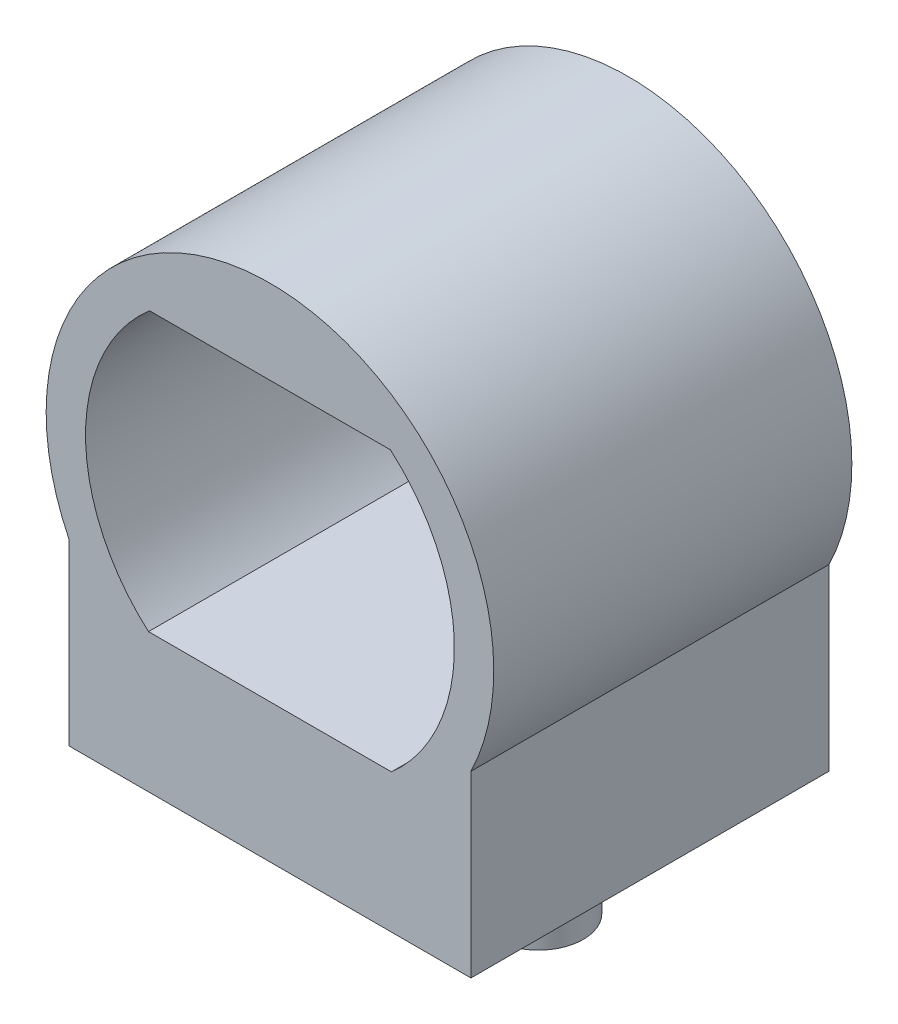
ISO-10303-21;
HEADER;
FILE_DESCRIPTION(('STEP AP214'),'2;1');
FILE_NAME('part.step','',(''),(''),'','','');
FILE_SCHEMA(('AUTOMOTIVE_DESIGN { 1 0 10303 214 1 1 1 1 }'));
ENDSEC;
DATA;
#1=APPLICATION_CONTEXT('core data for automotive mechanical design processes');
#2=APPLICATION_PROTOCOL_DEFINITION('international standard','automotive_design',2000,#1);
#3=PRODUCT_CONTEXT('',#1,'mechanical');
#4=PRODUCT('Part','Part','',(#3));
#5=PRODUCT_RELATED_PRODUCT_CATEGORY('part','',(#4));
#6=PRODUCT_DEFINITION_FORMATION('','',#4);
#7=PRODUCT_DEFINITION_CONTEXT('part definition',#1,'design');
#8=PRODUCT_DEFINITION('design','',#6,#7);
#9=PRODUCT_DEFINITION_SHAPE('','',#8);
#10=(LENGTH_UNIT() NAMED_UNIT(*) SI_UNIT(.MILLI.,.METRE.));
#11=(NAMED_UNIT(*) PLANE_ANGLE_UNIT() SI_UNIT($,.RADIAN.));
#12=(NAMED_UNIT(*) SI_UNIT($,.STERADIAN.) SOLID_ANGLE_UNIT());
#13=UNCERTAINTY_MEASURE_WITH_UNIT(LENGTH_MEASURE(1.E-05),#10,'distance_accuracy_value','');
#14=(GEOMETRIC_REPRESENTATION_CONTEXT(3) GLOBAL_UNCERTAINTY_ASSIGNED_CONTEXT((#13)) GLOBAL_UNIT_ASSIGNED_CONTEXT((#10,
#11,#12)) REPRESENTATION_CONTEXT('',''));
#15=CARTESIAN_POINT('',(0.,0.,0.));
#16=DIRECTION('',(0.,0.,1.));
#17=DIRECTION('',(1.,0.,0.));
#18=AXIS2_PLACEMENT_3D('',#15,#16,#17);
#19=CARTESIAN_POINT('',(0.,0.,0.));
#20=DIRECTION('',(0.,0.,1.));
#21=DIRECTION('',(1.,0.,0.));
#22=AXIS2_PLACEMENT_3D('',#19,#20,#21);
#23=PLANE('',#22);
#24=CARTESIAN_POINT('',(0.,0.,0.));
#25=DIRECTION('',(0.,0.,1.));
#26=DIRECTION('',(1.,0.,0.));
#27=AXIS2_PLACEMENT_3D('',#24,#25,#26);
#28=CIRCLE('',#27,10.3);
#29=CARTESIAN_POINT('',(6.78435700711571,-7.75,0.));
#30=VERTEX_POINT('',#29);
#31=CARTESIAN_POINT('',(6.72681202353686,7.8,0.));
#32=VERTEX_POINT('',#31);
#33=EDGE_CURVE('E67',#30,#32,#28,.T.);
#34=ORIENTED_EDGE('',*,*,#33,.F.);
#35=DIRECTION('',(1.,0.,0.));
#36=VECTOR('',#35,1.);
#37=CARTESIAN_POINT('',(0.,-7.75,0.));
#38=LINE('',#37,#36);
#39=CARTESIAN_POINT('',(-6.78435700711571,-7.75,0.));
#40=VERTEX_POINT('',#39);
#41=EDGE_CURVE('E125',#40,#30,#38,.T.);
#42=ORIENTED_EDGE('',*,*,#41,.F.);
#43=CARTESIAN_POINT('',(-6.72681202353686,7.8,0.));
#44=VERTEX_POINT('',#43);
#45=EDGE_CURVE('E145',#44,#40,#28,.T.);
#46=ORIENTED_EDGE('',*,*,#45,.F.);
#47=DIRECTION('',(-1.,0.,0.));
#48=VECTOR('',#47,1.);
#49=CARTESIAN_POINT('',(0.,7.8,0.));
#50=LINE('',#49,#48);
#51=EDGE_CURVE('E143',#32,#44,#50,.T.);
#52=ORIENTED_EDGE('',*,*,#51,.F.);
#53=EDGE_LOOP('',(#34,#42,#46,#52));
#54=FACE_BOUND('',#53,.T.);
#55=CARTESIAN_POINT('',(0.,0.,0.));
#56=DIRECTION('',(0.,0.,1.));
#57=DIRECTION('',(1.,0.,0.));
#58=AXIS2_PLACEMENT_3D('',#55,#56,#57);
#59=CIRCLE('',#58,12.5);
#60=CARTESIAN_POINT('',(11.2249721603218,-5.5,0.));
#61=VERTEX_POINT('',#60);
#62=CARTESIAN_POINT('',(-11.2249721603218,-5.5,0.));
#63=VERTEX_POINT('',#62);
#64=EDGE_CURVE('E132',#61,#63,#59,.T.);
#65=ORIENTED_EDGE('',*,*,#64,.T.);
#66=DIRECTION('',(0.,-1.,0.));
#67=VECTOR('',#66,1.);
#68=CARTESIAN_POINT('',(-11.2249721603218,0.,0.));
#69=LINE('',#68,#67);
#70=CARTESIAN_POINT('',(-11.2249721603218,-15.5,0.));
#71=VERTEX_POINT('',#70);
#72=EDGE_CURVE('E180',#63,#71,#69,.T.);
#73=ORIENTED_EDGE('',*,*,#72,.T.);
#74=DIRECTION('',(1.,0.,0.));
#75=VECTOR('',#74,1.);
#76=CARTESIAN_POINT('',(0.,-15.5,0.));
#77=LINE('',#76,#75);
#78=CARTESIAN_POINT('',(11.2249721603218,-15.5,0.));
#79=VERTEX_POINT('',#78);
#80=EDGE_CURVE('E184',#71,#79,#77,.T.);
#81=ORIENTED_EDGE('',*,*,#80,.T.);
#82=DIRECTION('',(0.,-1.,0.));
#83=VECTOR('',#82,1.);
#84=CARTESIAN_POINT('',(11.2249721603218,0.,0.));
#85=LINE('',#84,#83);
#86=EDGE_CURVE('E166',#61,#79,#85,.T.);
#87=ORIENTED_EDGE('',*,*,#86,.F.);
#88=EDGE_LOOP('',(#65,#73,#81,#87));
#89=FACE_BOUND('',#88,.T.);
#90=ADVANCED_FACE('F49',(#54,#89),#23,.T.);
#91=CARTESIAN_POINT('',(0.,0.,-20.));
#92=DIRECTION('',(0.,0.,1.));
#93=DIRECTION('',(1.,0.,0.));
#94=AXIS2_PLACEMENT_3D('',#91,#92,#93);
#95=CYLINDRICAL_SURFACE('',#94,12.5);
#96=ORIENTED_EDGE('',*,*,#64,.F.);
#97=DIRECTION('',(0.,0.,1.));
#98=VECTOR('',#97,1.);
#99=CARTESIAN_POINT('',(11.2249721603218,-5.5,-20.));
#100=LINE('',#99,#98);
#101=CARTESIAN_POINT('',(11.2249721603218,-5.5,-20.));
#102=VERTEX_POINT('',#101);
#103=EDGE_CURVE('E11',#102,#61,#100,.T.);
#104=ORIENTED_EDGE('',*,*,#103,.F.);
#105=CARTESIAN_POINT('',(0.,0.,-20.));
#106=DIRECTION('',(0.,0.,1.));
#107=DIRECTION('',(1.,0.,0.));
#108=AXIS2_PLACEMENT_3D('',#105,#106,#107);
#109=CIRCLE('',#108,12.5);
#110=CARTESIAN_POINT('',(-11.2249721603218,-5.5,-20.));
#111=VERTEX_POINT('',#110);
#112=EDGE_CURVE('E161',#102,#111,#109,.T.);
#113=ORIENTED_EDGE('',*,*,#112,.T.);
#114=DIRECTION('',(0.,0.,1.));
#115=VECTOR('',#114,1.);
#116=CARTESIAN_POINT('',(-11.2249721603218,-5.5,-20.));
#117=LINE('',#116,#115);
#118=EDGE_CURVE('E53',#111,#63,#117,.T.);
#119=ORIENTED_EDGE('',*,*,#118,.T.);
#120=EDGE_LOOP('',(#96,#104,#113,#119));
#121=FACE_BOUND('',#120,.T.);
#122=ADVANCED_FACE('F51',(#121),#95,.T.);
#123=CARTESIAN_POINT('',(11.2249721603218,0.,-20.));
#124=DIRECTION('',(-1.,0.,0.));
#125=DIRECTION('',(0.,-1.,0.));
#126=AXIS2_PLACEMENT_3D('',#123,#124,#125);
#127=PLANE('',#126);
#128=ORIENTED_EDGE('',*,*,#86,.T.);
#129=DIRECTION('',(0.,0.,1.));
#130=VECTOR('',#129,1.);
#131=CARTESIAN_POINT('',(11.2249721603218,-15.5,-20.));
#132=LINE('',#131,#130);
#133=CARTESIAN_POINT('',(11.2249721603218,-15.5,-20.));
#134=VERTEX_POINT('',#133);
#135=EDGE_CURVE('E59',#134,#79,#132,.T.);
#136=ORIENTED_EDGE('',*,*,#135,.F.);
#137=DIRECTION('',(0.,-1.,0.));
#138=VECTOR('',#137,1.);
#139=CARTESIAN_POINT('',(11.2249721603218,0.,-20.));
#140=LINE('',#139,#138);
#141=EDGE_CURVE('E174',#102,#134,#140,.T.);
#142=ORIENTED_EDGE('',*,*,#141,.F.);
#143=ORIENTED_EDGE('',*,*,#103,.T.);
#144=EDGE_LOOP('',(#128,#136,#142,#143));
#145=FACE_BOUND('',#144,.T.);
#146=ADVANCED_FACE('F207',(#145),#127,.F.);
#147=CARTESIAN_POINT('',(0.,-15.5,-20.));
#148=DIRECTION('',(0.,-1.,0.));
#149=DIRECTION('',(0.,0.,-1.));
#150=AXIS2_PLACEMENT_3D('',#147,#148,#149);
#151=PLANE('',#150);
#152=CARTESIAN_POINT('',(5.,-15.5,-10.));
#153=DIRECTION('',(0.,-1.,0.));
#154=DIRECTION('',(0.,0.,1.));
#155=AXIS2_PLACEMENT_3D('',#152,#153,#154);
#156=CIRCLE('',#155,2.5);
#157=CARTESIAN_POINT('',(5.,-15.5,-7.5));
#158=VERTEX_POINT('',#157);
#159=EDGE_CURVE('E262',#158,#158,#156,.T.);
#160=ORIENTED_EDGE('',*,*,#159,.F.);
#161=EDGE_LOOP('',(#160));
#162=FACE_BOUND('',#161,.T.);
#163=CARTESIAN_POINT('',(-5.,-15.5,-10.));
#164=DIRECTION('',(0.,-1.,0.));
#165=DIRECTION('',(0.,0.,-1.));
#166=AXIS2_PLACEMENT_3D('',#163,#164,#165);
#167=CIRCLE('',#166,2.5);
#168=CARTESIAN_POINT('',(-5.,-15.5,-12.5));
#169=VERTEX_POINT('',#168);
#170=EDGE_CURVE('E264',#169,#169,#167,.T.);
#171=ORIENTED_EDGE('',*,*,#170,.F.);
#172=EDGE_LOOP('',(#171));
#173=FACE_BOUND('',#172,.T.);
#174=ORIENTED_EDGE('',*,*,#80,.F.);
#175=DIRECTION('',(0.,0.,1.));
#176=VECTOR('',#175,1.);
#177=CARTESIAN_POINT('',(-11.2249721603218,-15.5,-20.));
#178=LINE('',#177,#176);
#179=CARTESIAN_POINT('',(-11.2249721603218,-15.5,-20.));
#180=VERTEX_POINT('',#179);
#181=EDGE_CURVE('E192',#180,#71,#178,.T.);
#182=ORIENTED_EDGE('',*,*,#181,.F.);
#183=DIRECTION('',(1.,0.,0.));
#184=VECTOR('',#183,1.);
#185=CARTESIAN_POINT('',(0.,-15.5,-20.));
#186=LINE('',#185,#184);
#187=EDGE_CURVE('E170',#180,#134,#186,.T.);
#188=ORIENTED_EDGE('',*,*,#187,.T.);
#189=ORIENTED_EDGE('',*,*,#135,.T.);
#190=EDGE_LOOP('',(#174,#182,#188,#189));
#191=FACE_BOUND('',#190,.T.);
#192=ADVANCED_FACE('F211',(#162,#173,#191),#151,.T.);
#193=CARTESIAN_POINT('',(-11.2249721603218,0.,-20.));
#194=DIRECTION('',(-1.,0.,0.));
#195=DIRECTION('',(0.,-1.,0.));
#196=AXIS2_PLACEMENT_3D('',#193,#194,#195);
#197=PLANE('',#196);
#198=ORIENTED_EDGE('',*,*,#72,.F.);
#199=ORIENTED_EDGE('',*,*,#118,.F.);
#200=DIRECTION('',(0.,-1.,0.));
#201=VECTOR('',#200,1.);
#202=CARTESIAN_POINT('',(-11.2249721603218,0.,-20.));
#203=LINE('',#202,#201);
#204=EDGE_CURVE('E165',#111,#180,#203,.T.);
#205=ORIENTED_EDGE('',*,*,#204,.T.);
#206=ORIENTED_EDGE('',*,*,#181,.T.);
#207=EDGE_LOOP('',(#198,#199,#205,#206));
#208=FACE_BOUND('',#207,.T.);
#209=ADVANCED_FACE('F202',(#208),#197,.T.);
#210=CARTESIAN_POINT('',(0.,0.,-20.));
#211=DIRECTION('',(0.,0.,1.));
#212=DIRECTION('',(1.,0.,0.));
#213=AXIS2_PLACEMENT_3D('',#210,#211,#212);
#214=PLANE('',#213);
#215=DIRECTION('',(-1.,0.,0.));
#216=VECTOR('',#215,1.);
#217=CARTESIAN_POINT('',(0.,-7.75,-20.));
#218=LINE('',#217,#216);
#219=CARTESIAN_POINT('',(6.78435700711571,-7.75,-20.));
#220=VERTEX_POINT('',#219);
#221=CARTESIAN_POINT('',(-6.78435700711571,-7.75,-20.));
#222=VERTEX_POINT('',#221);
#223=EDGE_CURVE('E138',#220,#222,#218,.T.);
#224=ORIENTED_EDGE('',*,*,#223,.F.);
#225=CARTESIAN_POINT('',(0.,0.,-20.));
#226=DIRECTION('',(0.,0.,1.));
#227=DIRECTION('',(1.,0.,0.));
#228=AXIS2_PLACEMENT_3D('',#225,#226,#227);
#229=CIRCLE('',#228,10.3);
#230=CARTESIAN_POINT('',(6.72681202353686,7.8,-20.));
#231=VERTEX_POINT('',#230);
#232=EDGE_CURVE('E118',#231,#220,#229,.F.);
#233=ORIENTED_EDGE('',*,*,#232,.F.);
#234=DIRECTION('',(1.,0.,0.));
#235=VECTOR('',#234,1.);
#236=CARTESIAN_POINT('',(0.,7.8,-20.));
#237=LINE('',#236,#235);
#238=CARTESIAN_POINT('',(-6.72681202353686,7.8,-20.));
#239=VERTEX_POINT('',#238);
#240=EDGE_CURVE('E128',#239,#231,#237,.T.);
#241=ORIENTED_EDGE('',*,*,#240,.F.);
#242=CARTESIAN_POINT('',(0.,0.,-20.));
#243=DIRECTION('',(0.,0.,1.));
#244=DIRECTION('',(1.,0.,0.));
#245=AXIS2_PLACEMENT_3D('',#242,#243,#244);
#246=CIRCLE('',#245,10.3);
#247=EDGE_CURVE('E75',#222,#239,#246,.F.);
#248=ORIENTED_EDGE('',*,*,#247,.F.);
#249=EDGE_LOOP('',(#224,#233,#241,#248));
#250=FACE_BOUND('',#249,.T.);
#251=ORIENTED_EDGE('',*,*,#112,.F.);
#252=ORIENTED_EDGE('',*,*,#141,.T.);
#253=ORIENTED_EDGE('',*,*,#187,.F.);
#254=ORIENTED_EDGE('',*,*,#204,.F.);
#255=EDGE_LOOP('',(#251,#252,#253,#254));
#256=FACE_BOUND('',#255,.T.);
#257=ADVANCED_FACE('F135',(#250,#256),#214,.F.);
#258=CARTESIAN_POINT('',(0.,0.,-20.0940986764331));
#259=DIRECTION('',(0.,0.,1.));
#260=DIRECTION('',(1.,0.,0.));
#261=AXIS2_PLACEMENT_3D('',#258,#259,#260);
#262=CYLINDRICAL_SURFACE('',#261,10.3);
#263=ORIENTED_EDGE('',*,*,#232,.T.);
#264=DIRECTION('',(0.,0.,1.));
#265=VECTOR('',#264,1.);
#266=CARTESIAN_POINT('',(6.78435700711571,-7.75,-20.0940986764331));
#267=LINE('',#266,#265);
#268=EDGE_CURVE('E133',#220,#30,#267,.T.);
#269=ORIENTED_EDGE('',*,*,#268,.T.);
#270=ORIENTED_EDGE('',*,*,#33,.T.);
#271=DIRECTION('',(0.,0.,1.));
#272=VECTOR('',#271,1.);
#273=CARTESIAN_POINT('',(6.72681202353686,7.8,-20.0940986764331));
#274=LINE('',#273,#272);
#275=EDGE_CURVE('E114',#231,#32,#274,.T.);
#276=ORIENTED_EDGE('',*,*,#275,.F.);
#277=EDGE_LOOP('',(#263,#269,#270,#276));
#278=FACE_BOUND('',#277,.T.);
#279=ADVANCED_FACE('F116',(#278),#262,.F.);
#280=CARTESIAN_POINT('',(0.,-7.75,-20.0940986764331));
#281=DIRECTION('',(0.,-1.,0.));
#282=DIRECTION('',(0.,0.,-1.));
#283=AXIS2_PLACEMENT_3D('',#280,#281,#282);
#284=PLANE('',#283);
#285=ORIENTED_EDGE('',*,*,#223,.T.);
#286=DIRECTION('',(0.,0.,1.));
#287=VECTOR('',#286,1.);
#288=CARTESIAN_POINT('',(-6.78435700711571,-7.75,-20.0940986764331));
#289=LINE('',#288,#287);
#290=EDGE_CURVE('E156',#222,#40,#289,.T.);
#291=ORIENTED_EDGE('',*,*,#290,.T.);
#292=ORIENTED_EDGE('',*,*,#41,.T.);
#293=ORIENTED_EDGE('',*,*,#268,.F.);
#294=EDGE_LOOP('',(#285,#291,#292,#293));
#295=FACE_BOUND('',#294,.T.);
#296=ADVANCED_FACE('F238',(#295),#284,.F.);
#297=ORIENTED_EDGE('',*,*,#247,.T.);
#298=DIRECTION('',(0.,0.,1.));
#299=VECTOR('',#298,1.);
#300=CARTESIAN_POINT('',(-6.72681202353686,7.8,-20.0940986764331));
#301=LINE('',#300,#299);
#302=EDGE_CURVE('E124',#239,#44,#301,.T.);
#303=ORIENTED_EDGE('',*,*,#302,.T.);
#304=ORIENTED_EDGE('',*,*,#45,.T.);
#305=ORIENTED_EDGE('',*,*,#290,.F.);
#306=EDGE_LOOP('',(#297,#303,#304,#305));
#307=FACE_BOUND('',#306,.T.);
#308=ADVANCED_FACE('F235',(#307),#262,.F.);
#309=CARTESIAN_POINT('',(0.,7.8,-20.0940986764331));
#310=DIRECTION('',(0.,1.,0.));
#311=DIRECTION('',(0.,0.,1.));
#312=AXIS2_PLACEMENT_3D('',#309,#310,#311);
#313=PLANE('',#312);
#314=ORIENTED_EDGE('',*,*,#240,.T.);
#315=ORIENTED_EDGE('',*,*,#275,.T.);
#316=ORIENTED_EDGE('',*,*,#51,.T.);
#317=ORIENTED_EDGE('',*,*,#302,.F.);
#318=EDGE_LOOP('',(#314,#315,#316,#317));
#319=FACE_BOUND('',#318,.T.);
#320=ADVANCED_FACE('F129',(#319),#313,.F.);
#321=CARTESIAN_POINT('',(-5.,-20.5,-10.));
#322=DIRECTION('',(0.,1.,0.));
#323=DIRECTION('',(0.,0.,1.));
#324=AXIS2_PLACEMENT_3D('',#321,#322,#323);
#325=CYLINDRICAL_SURFACE('',#324,2.5);
#326=CARTESIAN_POINT('',(-5.,-20.5,-10.));
#327=DIRECTION('',(0.,-1.,0.));
#328=DIRECTION('',(0.,0.,-1.));
#329=AXIS2_PLACEMENT_3D('',#326,#327,#328);
#330=CIRCLE('',#329,2.5);
#331=CARTESIAN_POINT('',(-5.,-20.5,-12.5));
#332=VERTEX_POINT('',#331);
#333=EDGE_CURVE('E269',#332,#332,#330,.T.);
#334=ORIENTED_EDGE('',*,*,#333,.F.);
#335=EDGE_LOOP('',(#334));
#336=FACE_BOUND('',#335,.T.);
#337=ORIENTED_EDGE('',*,*,#170,.T.);
#338=EDGE_LOOP('',(#337));
#339=FACE_BOUND('',#338,.T.);
#340=ADVANCED_FACE('F234',(#336,#339),#325,.T.);
#341=CARTESIAN_POINT('',(-5.,-20.5,-10.));
#342=DIRECTION('',(0.,-1.,0.));
#343=DIRECTION('',(0.,0.,-1.));
#344=AXIS2_PLACEMENT_3D('',#341,#342,#343);
#345=PLANE('',#344);
#346=ORIENTED_EDGE('',*,*,#333,.T.);
#347=EDGE_LOOP('',(#346));
#348=FACE_BOUND('',#347,.T.);
#349=ADVANCED_FACE('F243',(#348),#345,.T.);
#350=CARTESIAN_POINT('',(5.,-20.5,-10.));
#351=DIRECTION('',(0.,1.,0.));
#352=DIRECTION('',(0.,0.,1.));
#353=AXIS2_PLACEMENT_3D('',#350,#351,#352);
#354=CYLINDRICAL_SURFACE('',#353,2.5);
#355=CARTESIAN_POINT('',(5.,-20.5,-10.));
#356=DIRECTION('',(0.,-1.,0.));
#357=DIRECTION('',(0.,0.,1.));
#358=AXIS2_PLACEMENT_3D('',#355,#356,#357);
#359=CIRCLE('',#358,2.5);
#360=CARTESIAN_POINT('',(5.,-20.5,-7.5));
#361=VERTEX_POINT('',#360);
#362=EDGE_CURVE('E260',#361,#361,#359,.T.);
#363=ORIENTED_EDGE('',*,*,#362,.F.);
#364=EDGE_LOOP('',(#363));
#365=FACE_BOUND('',#364,.T.);
#366=ORIENTED_EDGE('',*,*,#159,.T.);
#367=EDGE_LOOP('',(#366));
#368=FACE_BOUND('',#367,.T.);
#369=ADVANCED_FACE('F247',(#365,#368),#354,.T.);
#370=CARTESIAN_POINT('',(5.,-20.5,-10.));
#371=DIRECTION('',(0.,1.,0.));
#372=DIRECTION('',(0.,0.,1.));
#373=AXIS2_PLACEMENT_3D('',#370,#371,#372);
#374=PLANE('',#373);
#375=ORIENTED_EDGE('',*,*,#362,.T.);
#376=EDGE_LOOP('',(#375));
#377=FACE_BOUND('',#376,.T.);
#378=ADVANCED_FACE('F249',(#377),#374,.F.);
#379=CLOSED_SHELL('',(#90,#122,#146,#192,#209,#257,#279,#296,#308,#320,#340,#349,#369,#378));
#380=MANIFOLD_SOLID_BREP('B2',#379);
#381=ADVANCED_BREP_SHAPE_REPRESENTATION('',(#18,#380),#14);
#382=SHAPE_DEFINITION_REPRESENTATION(#9,#381);
ENDSEC;
END-ISO-10303-21;
